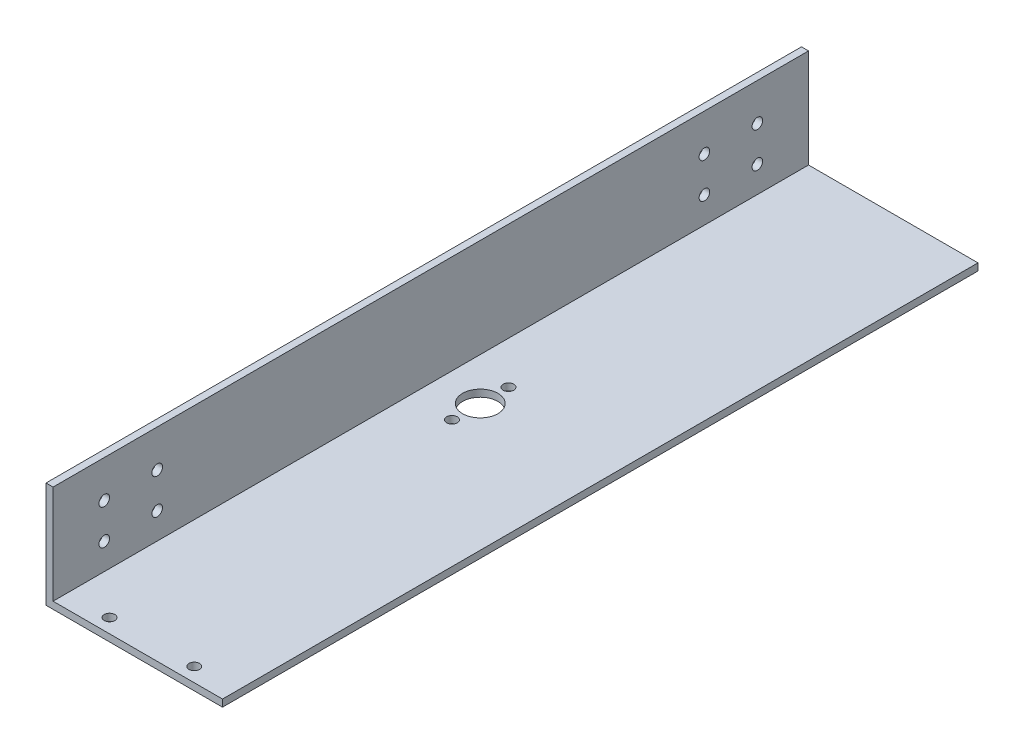
ISO-10303-21;
HEADER;
FILE_DESCRIPTION(('STEP AP214'),'2;1');
FILE_NAME('part.step','',(''),(''),'','','');
FILE_SCHEMA(('AUTOMOTIVE_DESIGN { 1 0 10303 214 1 1 1 1 }'));
ENDSEC;
DATA;
#1=APPLICATION_CONTEXT('core data for automotive mechanical design processes');
#2=APPLICATION_PROTOCOL_DEFINITION('international standard','automotive_design',2000,#1);
#3=PRODUCT_CONTEXT('',#1,'mechanical');
#4=PRODUCT('Part','Part','',(#3));
#5=PRODUCT_RELATED_PRODUCT_CATEGORY('part','',(#4));
#6=PRODUCT_DEFINITION_FORMATION('','',#4);
#7=PRODUCT_DEFINITION_CONTEXT('part definition',#1,'design');
#8=PRODUCT_DEFINITION('design','',#6,#7);
#9=PRODUCT_DEFINITION_SHAPE('','',#8);
#10=(LENGTH_UNIT() NAMED_UNIT(*) SI_UNIT(.MILLI.,.METRE.));
#11=(NAMED_UNIT(*) PLANE_ANGLE_UNIT() SI_UNIT($,.RADIAN.));
#12=(NAMED_UNIT(*) SI_UNIT($,.STERADIAN.) SOLID_ANGLE_UNIT());
#13=UNCERTAINTY_MEASURE_WITH_UNIT(LENGTH_MEASURE(1.E-05),#10,'distance_accuracy_value','');
#14=(GEOMETRIC_REPRESENTATION_CONTEXT(3) GLOBAL_UNCERTAINTY_ASSIGNED_CONTEXT((#13)) GLOBAL_UNIT_ASSIGNED_CONTEXT((#10,
#11,#12)) REPRESENTATION_CONTEXT('',''));
#15=CARTESIAN_POINT('',(0.,0.,0.));
#16=DIRECTION('',(0.,0.,1.));
#17=DIRECTION('',(1.,0.,0.));
#18=AXIS2_PLACEMENT_3D('',#15,#16,#17);
#19=CARTESIAN_POINT('',(0.,0.,0.));
#20=DIRECTION('',(0.,0.,-1.));
#21=DIRECTION('',(-1.,0.,0.));
#22=AXIS2_PLACEMENT_3D('',#19,#20,#21);
#23=PLANE('',#22);
#24=DIRECTION('',(1.,0.,0.));
#25=VECTOR('',#24,1.);
#26=CARTESIAN_POINT('',(50.,0.,0.));
#27=LINE('',#26,#25);
#28=CARTESIAN_POINT('',(0.,0.,0.));
#29=VERTEX_POINT('',#28);
#30=CARTESIAN_POINT('',(50.,0.,0.));
#31=VERTEX_POINT('',#30);
#32=EDGE_CURVE('E101',#29,#31,#27,.T.);
#33=ORIENTED_EDGE('',*,*,#32,.F.);
#34=DIRECTION('',(0.,-1.,0.));
#35=VECTOR('',#34,1.);
#36=CARTESIAN_POINT('',(0.,0.,0.));
#37=LINE('',#36,#35);
#38=CARTESIAN_POINT('',(0.,30.,0.));
#39=VERTEX_POINT('',#38);
#40=EDGE_CURVE('E123',#39,#29,#37,.T.);
#41=ORIENTED_EDGE('',*,*,#40,.F.);
#42=DIRECTION('',(-1.,0.,0.));
#43=VECTOR('',#42,1.);
#44=CARTESIAN_POINT('',(0.,30.,0.));
#45=LINE('',#44,#43);
#46=CARTESIAN_POINT('',(2.,30.,0.));
#47=VERTEX_POINT('',#46);
#48=EDGE_CURVE('E120',#47,#39,#45,.T.);
#49=ORIENTED_EDGE('',*,*,#48,.F.);
#50=DIRECTION('',(0.,1.,0.));
#51=VECTOR('',#50,1.);
#52=CARTESIAN_POINT('',(2.,30.,0.));
#53=LINE('',#52,#51);
#54=CARTESIAN_POINT('',(2.,2.,0.));
#55=VERTEX_POINT('',#54);
#56=EDGE_CURVE('E117',#55,#47,#53,.T.);
#57=ORIENTED_EDGE('',*,*,#56,.F.);
#58=DIRECTION('',(-1.,0.,0.));
#59=VECTOR('',#58,1.);
#60=CARTESIAN_POINT('',(2.,2.,0.));
#61=LINE('',#60,#59);
#62=CARTESIAN_POINT('',(50.,2.,0.));
#63=VERTEX_POINT('',#62);
#64=EDGE_CURVE('E104',#63,#55,#61,.T.);
#65=ORIENTED_EDGE('',*,*,#64,.F.);
#66=DIRECTION('',(0.,1.,0.));
#67=VECTOR('',#66,1.);
#68=CARTESIAN_POINT('',(50.,2.,0.));
#69=LINE('',#68,#67);
#70=EDGE_CURVE('E93',#31,#63,#69,.T.);
#71=ORIENTED_EDGE('',*,*,#70,.F.);
#72=EDGE_LOOP('',(#33,#41,#49,#57,#65,#71));
#73=FACE_BOUND('',#72,.T.);
#74=ADVANCED_FACE('F37',(#73),#23,.T.);
#75=CARTESIAN_POINT('',(0.,0.,272.309518948453));
#76=DIRECTION('',(1.,0.,0.));
#77=DIRECTION('',(0.,0.,-1.));
#78=AXIS2_PLACEMENT_3D('',#75,#76,#77);
#79=PLANE('',#78);
#80=CARTESIAN_POINT('',(0.,9.45,199.499999999999));
#81=DIRECTION('',(1.,0.,0.));
#82=DIRECTION('',(0.,0.,-1.));
#83=AXIS2_PLACEMENT_3D('',#80,#81,#82);
#84=CIRCLE('',#83,1.5);
#85=CARTESIAN_POINT('',(0.,9.45,197.999999999999));
#86=VERTEX_POINT('',#85);
#87=EDGE_CURVE('E198',#86,#86,#84,.T.);
#88=ORIENTED_EDGE('',*,*,#87,.T.);
#89=EDGE_LOOP('',(#88));
#90=FACE_BOUND('',#89,.T.);
#91=CARTESIAN_POINT('',(0.,19.45,199.499999999999));
#92=DIRECTION('',(1.,0.,0.));
#93=DIRECTION('',(0.,0.,-1.));
#94=AXIS2_PLACEMENT_3D('',#91,#92,#93);
#95=CIRCLE('',#94,1.5);
#96=CARTESIAN_POINT('',(0.,19.45,197.999999999999));
#97=VERTEX_POINT('',#96);
#98=EDGE_CURVE('E192',#97,#97,#95,.T.);
#99=ORIENTED_EDGE('',*,*,#98,.T.);
#100=EDGE_LOOP('',(#99));
#101=FACE_BOUND('',#100,.T.);
#102=CARTESIAN_POINT('',(0.,19.4500124763544,184.499999999997));
#103=DIRECTION('',(1.,0.,0.));
#104=DIRECTION('',(0.,0.,-1.));
#105=AXIS2_PLACEMENT_3D('',#102,#103,#104);
#106=CIRCLE('',#105,1.5);
#107=CARTESIAN_POINT('',(0.,19.4500124763544,182.999999999997));
#108=VERTEX_POINT('',#107);
#109=EDGE_CURVE('E186',#108,#108,#106,.T.);
#110=ORIENTED_EDGE('',*,*,#109,.T.);
#111=EDGE_LOOP('',(#110));
#112=FACE_BOUND('',#111,.T.);
#113=CARTESIAN_POINT('',(0.,9.45,184.499999999999));
#114=DIRECTION('',(1.,0.,0.));
#115=DIRECTION('',(0.,0.,-1.));
#116=AXIS2_PLACEMENT_3D('',#113,#114,#115);
#117=CIRCLE('',#116,1.5);
#118=CARTESIAN_POINT('',(0.,9.45,182.999999999999));
#119=VERTEX_POINT('',#118);
#120=EDGE_CURVE('E180',#119,#119,#117,.T.);
#121=ORIENTED_EDGE('',*,*,#120,.T.);
#122=EDGE_LOOP('',(#121));
#123=FACE_BOUND('',#122,.T.);
#124=CARTESIAN_POINT('',(0.,19.45,29.5));
#125=DIRECTION('',(1.,0.,0.));
#126=DIRECTION('',(0.,0.,-1.));
#127=AXIS2_PLACEMENT_3D('',#124,#125,#126);
#128=CIRCLE('',#127,1.5);
#129=CARTESIAN_POINT('',(0.,19.45,28.));
#130=VERTEX_POINT('',#129);
#131=EDGE_CURVE('E174',#130,#130,#128,.T.);
#132=ORIENTED_EDGE('',*,*,#131,.T.);
#133=EDGE_LOOP('',(#132));
#134=FACE_BOUND('',#133,.T.);
#135=CARTESIAN_POINT('',(0.,9.45000000000001,29.5));
#136=DIRECTION('',(1.,0.,0.));
#137=DIRECTION('',(0.,0.,-1.));
#138=AXIS2_PLACEMENT_3D('',#135,#136,#137);
#139=CIRCLE('',#138,1.5);
#140=CARTESIAN_POINT('',(0.,9.45000000000001,28.));
#141=VERTEX_POINT('',#140);
#142=EDGE_CURVE('E168',#141,#141,#139,.T.);
#143=ORIENTED_EDGE('',*,*,#142,.T.);
#144=EDGE_LOOP('',(#143));
#145=FACE_BOUND('',#144,.T.);
#146=CARTESIAN_POINT('',(0.,9.45000000000001,14.5));
#147=DIRECTION('',(1.,0.,0.));
#148=DIRECTION('',(0.,0.,-1.));
#149=AXIS2_PLACEMENT_3D('',#146,#147,#148);
#150=CIRCLE('',#149,1.5);
#151=CARTESIAN_POINT('',(0.,9.45000000000001,13.));
#152=VERTEX_POINT('',#151);
#153=EDGE_CURVE('E162',#152,#152,#150,.T.);
#154=ORIENTED_EDGE('',*,*,#153,.T.);
#155=EDGE_LOOP('',(#154));
#156=FACE_BOUND('',#155,.T.);
#157=CARTESIAN_POINT('',(0.,19.45,14.5));
#158=DIRECTION('',(1.,0.,0.));
#159=DIRECTION('',(0.,0.,-1.));
#160=AXIS2_PLACEMENT_3D('',#157,#158,#159);
#161=CIRCLE('',#160,1.5);
#162=CARTESIAN_POINT('',(0.,19.45,13.));
#163=VERTEX_POINT('',#162);
#164=EDGE_CURVE('E156',#163,#163,#161,.T.);
#165=ORIENTED_EDGE('',*,*,#164,.T.);
#166=EDGE_LOOP('',(#165));
#167=FACE_BOUND('',#166,.T.);
#168=DIRECTION('',(0.,0.,-1.));
#169=VECTOR('',#168,1.);
#170=CARTESIAN_POINT('',(0.,0.,272.309518948453));
#171=LINE('',#170,#169);
#172=CARTESIAN_POINT('',(0.,0.,214.));
#173=VERTEX_POINT('',#172);
#174=EDGE_CURVE('E107',#173,#29,#171,.T.);
#175=ORIENTED_EDGE('',*,*,#174,.F.);
#176=DIRECTION('',(0.,1.,0.));
#177=VECTOR('',#176,1.);
#178=CARTESIAN_POINT('',(0.,0.,214.));
#179=LINE('',#178,#177);
#180=CARTESIAN_POINT('',(0.,30.,214.));
#181=VERTEX_POINT('',#180);
#182=EDGE_CURVE('E41',#173,#181,#179,.T.);
#183=ORIENTED_EDGE('',*,*,#182,.T.);
#184=DIRECTION('',(0.,0.,-1.));
#185=VECTOR('',#184,1.);
#186=CARTESIAN_POINT('',(0.,30.,272.309518948453));
#187=LINE('',#186,#185);
#188=EDGE_CURVE('E126',#181,#39,#187,.T.);
#189=ORIENTED_EDGE('',*,*,#188,.T.);
#190=ORIENTED_EDGE('',*,*,#40,.T.);
#191=EDGE_LOOP('',(#175,#183,#189,#190));
#192=FACE_BOUND('',#191,.T.);
#193=ADVANCED_FACE('F246',(#90,#101,#112,#123,#134,#145,#156,#167,#192),#79,.F.);
#194=CARTESIAN_POINT('',(0.,30.,272.309518948453));
#195=DIRECTION('',(0.,-1.,0.));
#196=DIRECTION('',(0.,0.,-1.));
#197=AXIS2_PLACEMENT_3D('',#194,#195,#196);
#198=PLANE('',#197);
#199=ORIENTED_EDGE('',*,*,#188,.F.);
#200=DIRECTION('',(1.,0.,0.));
#201=VECTOR('',#200,1.);
#202=CARTESIAN_POINT('',(0.,30.,214.));
#203=LINE('',#202,#201);
#204=CARTESIAN_POINT('',(2.,30.,214.));
#205=VERTEX_POINT('',#204);
#206=EDGE_CURVE('E137',#181,#205,#203,.T.);
#207=ORIENTED_EDGE('',*,*,#206,.T.);
#208=DIRECTION('',(0.,0.,-1.));
#209=VECTOR('',#208,1.);
#210=CARTESIAN_POINT('',(2.,30.,272.309518948453));
#211=LINE('',#210,#209);
#212=EDGE_CURVE('E128',#205,#47,#211,.T.);
#213=ORIENTED_EDGE('',*,*,#212,.T.);
#214=ORIENTED_EDGE('',*,*,#48,.T.);
#215=EDGE_LOOP('',(#199,#207,#213,#214));
#216=FACE_BOUND('',#215,.T.);
#217=ADVANCED_FACE('F251',(#216),#198,.F.);
#218=CARTESIAN_POINT('',(2.,30.,272.309518948453));
#219=DIRECTION('',(-1.,0.,0.));
#220=DIRECTION('',(0.,0.,1.));
#221=AXIS2_PLACEMENT_3D('',#218,#219,#220);
#222=PLANE('',#221);
#223=CARTESIAN_POINT('',(2.,9.45,199.499999999999));
#224=DIRECTION('',(1.,0.,0.));
#225=DIRECTION('',(0.,0.,-1.));
#226=AXIS2_PLACEMENT_3D('',#223,#224,#225);
#227=CIRCLE('',#226,1.5);
#228=CARTESIAN_POINT('',(2.,9.45,197.999999999999));
#229=VERTEX_POINT('',#228);
#230=EDGE_CURVE('E201',#229,#229,#227,.T.);
#231=ORIENTED_EDGE('',*,*,#230,.F.);
#232=EDGE_LOOP('',(#231));
#233=FACE_BOUND('',#232,.T.);
#234=CARTESIAN_POINT('',(2.,19.45,199.499999999999));
#235=DIRECTION('',(1.,0.,0.));
#236=DIRECTION('',(0.,0.,-1.));
#237=AXIS2_PLACEMENT_3D('',#234,#235,#236);
#238=CIRCLE('',#237,1.5);
#239=CARTESIAN_POINT('',(2.,19.45,197.999999999999));
#240=VERTEX_POINT('',#239);
#241=EDGE_CURVE('E195',#240,#240,#238,.T.);
#242=ORIENTED_EDGE('',*,*,#241,.F.);
#243=EDGE_LOOP('',(#242));
#244=FACE_BOUND('',#243,.T.);
#245=CARTESIAN_POINT('',(2.,19.4500124763544,184.499999999997));
#246=DIRECTION('',(1.,0.,0.));
#247=DIRECTION('',(0.,0.,-1.));
#248=AXIS2_PLACEMENT_3D('',#245,#246,#247);
#249=CIRCLE('',#248,1.5);
#250=CARTESIAN_POINT('',(2.,19.4500124763544,182.999999999997));
#251=VERTEX_POINT('',#250);
#252=EDGE_CURVE('E189',#251,#251,#249,.T.);
#253=ORIENTED_EDGE('',*,*,#252,.F.);
#254=EDGE_LOOP('',(#253));
#255=FACE_BOUND('',#254,.T.);
#256=CARTESIAN_POINT('',(2.,9.45,184.499999999999));
#257=DIRECTION('',(1.,0.,0.));
#258=DIRECTION('',(0.,0.,-1.));
#259=AXIS2_PLACEMENT_3D('',#256,#257,#258);
#260=CIRCLE('',#259,1.5);
#261=CARTESIAN_POINT('',(2.,9.45,182.999999999999));
#262=VERTEX_POINT('',#261);
#263=EDGE_CURVE('E183',#262,#262,#260,.T.);
#264=ORIENTED_EDGE('',*,*,#263,.F.);
#265=EDGE_LOOP('',(#264));
#266=FACE_BOUND('',#265,.T.);
#267=CARTESIAN_POINT('',(2.,19.45,29.5));
#268=DIRECTION('',(1.,0.,0.));
#269=DIRECTION('',(0.,0.,-1.));
#270=AXIS2_PLACEMENT_3D('',#267,#268,#269);
#271=CIRCLE('',#270,1.5);
#272=CARTESIAN_POINT('',(2.,19.45,28.));
#273=VERTEX_POINT('',#272);
#274=EDGE_CURVE('E177',#273,#273,#271,.T.);
#275=ORIENTED_EDGE('',*,*,#274,.F.);
#276=EDGE_LOOP('',(#275));
#277=FACE_BOUND('',#276,.T.);
#278=CARTESIAN_POINT('',(2.,9.45000000000001,29.5));
#279=DIRECTION('',(1.,0.,0.));
#280=DIRECTION('',(0.,0.,-1.));
#281=AXIS2_PLACEMENT_3D('',#278,#279,#280);
#282=CIRCLE('',#281,1.5);
#283=CARTESIAN_POINT('',(2.,9.45000000000001,28.));
#284=VERTEX_POINT('',#283);
#285=EDGE_CURVE('E171',#284,#284,#282,.T.);
#286=ORIENTED_EDGE('',*,*,#285,.F.);
#287=EDGE_LOOP('',(#286));
#288=FACE_BOUND('',#287,.T.);
#289=CARTESIAN_POINT('',(2.,9.45000000000001,14.5));
#290=DIRECTION('',(1.,0.,0.));
#291=DIRECTION('',(0.,0.,-1.));
#292=AXIS2_PLACEMENT_3D('',#289,#290,#291);
#293=CIRCLE('',#292,1.5);
#294=CARTESIAN_POINT('',(2.,9.45000000000001,13.));
#295=VERTEX_POINT('',#294);
#296=EDGE_CURVE('E165',#295,#295,#293,.T.);
#297=ORIENTED_EDGE('',*,*,#296,.F.);
#298=EDGE_LOOP('',(#297));
#299=FACE_BOUND('',#298,.T.);
#300=CARTESIAN_POINT('',(2.,19.45,14.5));
#301=DIRECTION('',(1.,0.,0.));
#302=DIRECTION('',(0.,0.,-1.));
#303=AXIS2_PLACEMENT_3D('',#300,#301,#302);
#304=CIRCLE('',#303,1.5);
#305=CARTESIAN_POINT('',(2.,19.45,13.));
#306=VERTEX_POINT('',#305);
#307=EDGE_CURVE('E159',#306,#306,#304,.T.);
#308=ORIENTED_EDGE('',*,*,#307,.F.);
#309=EDGE_LOOP('',(#308));
#310=FACE_BOUND('',#309,.T.);
#311=ORIENTED_EDGE('',*,*,#212,.F.);
#312=DIRECTION('',(0.,-1.,0.));
#313=VECTOR('',#312,1.);
#314=CARTESIAN_POINT('',(2.,30.,214.));
#315=LINE('',#314,#313);
#316=CARTESIAN_POINT('',(2.,2.,214.));
#317=VERTEX_POINT('',#316);
#318=EDGE_CURVE('E135',#205,#317,#315,.T.);
#319=ORIENTED_EDGE('',*,*,#318,.T.);
#320=DIRECTION('',(0.,0.,-1.));
#321=VECTOR('',#320,1.);
#322=CARTESIAN_POINT('',(2.,2.,272.309518948453));
#323=LINE('',#322,#321);
#324=EDGE_CURVE('E130',#317,#55,#323,.T.);
#325=ORIENTED_EDGE('',*,*,#324,.T.);
#326=ORIENTED_EDGE('',*,*,#56,.T.);
#327=EDGE_LOOP('',(#311,#319,#325,#326));
#328=FACE_BOUND('',#327,.T.);
#329=ADVANCED_FACE('F221',(#233,#244,#255,#266,#277,#288,#299,#310,#328),#222,.F.);
#330=CARTESIAN_POINT('',(2.,2.,272.309518948453));
#331=DIRECTION('',(0.,-1.,0.));
#332=DIRECTION('',(0.,0.,-1.));
#333=AXIS2_PLACEMENT_3D('',#330,#331,#332);
#334=PLANE('',#333);
#335=CARTESIAN_POINT('',(38.0000000000025,2.00000000000002,210.000000000004));
#336=DIRECTION('',(0.,1.,0.));
#337=DIRECTION('',(0.,0.,1.));
#338=AXIS2_PLACEMENT_3D('',#335,#336,#337);
#339=CIRCLE('',#338,1.50000000000002);
#340=CARTESIAN_POINT('',(38.0000000000025,2.00000000000002,211.500000000004));
#341=VERTEX_POINT('',#340);
#342=EDGE_CURVE('E213',#341,#341,#339,.T.);
#343=ORIENTED_EDGE('',*,*,#342,.F.);
#344=EDGE_LOOP('',(#343));
#345=FACE_BOUND('',#344,.T.);
#346=CARTESIAN_POINT('',(14.0000000000025,2.00000000000002,210.000000000004));
#347=DIRECTION('',(0.,1.,0.));
#348=DIRECTION('',(0.,0.,1.));
#349=AXIS2_PLACEMENT_3D('',#346,#347,#348);
#350=CIRCLE('',#349,1.50000000000001);
#351=CARTESIAN_POINT('',(14.0000000000025,2.00000000000002,211.500000000004));
#352=VERTEX_POINT('',#351);
#353=EDGE_CURVE('E207',#352,#352,#350,.T.);
#354=ORIENTED_EDGE('',*,*,#353,.F.);
#355=EDGE_LOOP('',(#354));
#356=FACE_BOUND('',#355,.T.);
#357=CARTESIAN_POINT('',(14.0000001259329,2.,96.9999999761338));
#358=DIRECTION('',(0.,-1.,0.));
#359=DIRECTION('',(0.,0.,-1.));
#360=AXIS2_PLACEMENT_3D('',#357,#358,#359);
#361=CIRCLE('',#360,1.50000000146554);
#362=CARTESIAN_POINT('',(14.0000001259329,2.,95.4999999746682));
#363=VERTEX_POINT('',#362);
#364=EDGE_CURVE('E150',#363,#363,#361,.T.);
#365=ORIENTED_EDGE('',*,*,#364,.T.);
#366=EDGE_LOOP('',(#365));
#367=FACE_BOUND('',#366,.T.);
#368=CARTESIAN_POINT('',(14.000000125933,2.,112.999999976134));
#369=DIRECTION('',(0.,-1.,0.));
#370=DIRECTION('',(0.,0.,-1.));
#371=AXIS2_PLACEMENT_3D('',#368,#369,#370);
#372=CIRCLE('',#371,1.50000000146554);
#373=CARTESIAN_POINT('',(14.000000125933,2.,111.499999974668));
#374=VERTEX_POINT('',#373);
#375=EDGE_CURVE('E144',#374,#374,#372,.T.);
#376=ORIENTED_EDGE('',*,*,#375,.T.);
#377=EDGE_LOOP('',(#376));
#378=FACE_BOUND('',#377,.T.);
#379=CARTESIAN_POINT('',(13.9999999997861,2.,105.));
#380=DIRECTION('',(0.,-1.,0.));
#381=DIRECTION('',(0.,0.,-1.));
#382=AXIS2_PLACEMENT_3D('',#379,#380,#381);
#383=CIRCLE('',#382,5.);
#384=CARTESIAN_POINT('',(13.9999999997861,2.,100.));
#385=VERTEX_POINT('',#384);
#386=EDGE_CURVE('E109',#385,#385,#383,.T.);
#387=ORIENTED_EDGE('',*,*,#386,.T.);
#388=EDGE_LOOP('',(#387));
#389=FACE_BOUND('',#388,.T.);
#390=ORIENTED_EDGE('',*,*,#324,.F.);
#391=DIRECTION('',(1.,0.,0.));
#392=VECTOR('',#391,1.);
#393=CARTESIAN_POINT('',(2.,2.,214.));
#394=LINE('',#393,#392);
#395=CARTESIAN_POINT('',(50.,2.,214.));
#396=VERTEX_POINT('',#395);
#397=EDGE_CURVE('E58',#317,#396,#394,.T.);
#398=ORIENTED_EDGE('',*,*,#397,.T.);
#399=DIRECTION('',(0.,0.,-1.));
#400=VECTOR('',#399,1.);
#401=CARTESIAN_POINT('',(50.,2.,272.309518948453));
#402=LINE('',#401,#400);
#403=EDGE_CURVE('E97',#396,#63,#402,.T.);
#404=ORIENTED_EDGE('',*,*,#403,.T.);
#405=ORIENTED_EDGE('',*,*,#64,.T.);
#406=EDGE_LOOP('',(#390,#398,#404,#405));
#407=FACE_BOUND('',#406,.T.);
#408=ADVANCED_FACE('F133',(#345,#356,#367,#378,#389,#407),#334,.F.);
#409=CARTESIAN_POINT('',(50.,2.,272.309518948453));
#410=DIRECTION('',(-1.,0.,0.));
#411=DIRECTION('',(0.,0.,1.));
#412=AXIS2_PLACEMENT_3D('',#409,#410,#411);
#413=PLANE('',#412);
#414=ORIENTED_EDGE('',*,*,#403,.F.);
#415=DIRECTION('',(0.,-1.,0.));
#416=VECTOR('',#415,1.);
#417=CARTESIAN_POINT('',(50.,2.,214.));
#418=LINE('',#417,#416);
#419=CARTESIAN_POINT('',(50.,0.,214.));
#420=VERTEX_POINT('',#419);
#421=EDGE_CURVE('E46',#396,#420,#418,.T.);
#422=ORIENTED_EDGE('',*,*,#421,.T.);
#423=DIRECTION('',(0.,0.,-1.));
#424=VECTOR('',#423,1.);
#425=CARTESIAN_POINT('',(50.,0.,272.309518948453));
#426=LINE('',#425,#424);
#427=EDGE_CURVE('E90',#420,#31,#426,.T.);
#428=ORIENTED_EDGE('',*,*,#427,.T.);
#429=ORIENTED_EDGE('',*,*,#70,.T.);
#430=EDGE_LOOP('',(#414,#422,#428,#429));
#431=FACE_BOUND('',#430,.T.);
#432=ADVANCED_FACE('F92',(#431),#413,.F.);
#433=CARTESIAN_POINT('',(50.,0.,272.309518948453));
#434=DIRECTION('',(0.,1.,0.));
#435=DIRECTION('',(-1.,0.,0.));
#436=AXIS2_PLACEMENT_3D('',#433,#434,#435);
#437=PLANE('',#436);
#438=CARTESIAN_POINT('',(38.0000000000025,0.,210.000000000004));
#439=DIRECTION('',(0.,1.,0.));
#440=DIRECTION('',(0.,0.,1.));
#441=AXIS2_PLACEMENT_3D('',#438,#439,#440);
#442=CIRCLE('',#441,1.50000000000002);
#443=CARTESIAN_POINT('',(38.0000000000025,0.,211.500000000004));
#444=VERTEX_POINT('',#443);
#445=EDGE_CURVE('E210',#444,#444,#442,.T.);
#446=ORIENTED_EDGE('',*,*,#445,.T.);
#447=EDGE_LOOP('',(#446));
#448=FACE_BOUND('',#447,.T.);
#449=CARTESIAN_POINT('',(14.0000000000025,0.,210.000000000004));
#450=DIRECTION('',(0.,1.,0.));
#451=DIRECTION('',(0.,0.,1.));
#452=AXIS2_PLACEMENT_3D('',#449,#450,#451);
#453=CIRCLE('',#452,1.50000000000001);
#454=CARTESIAN_POINT('',(14.0000000000025,0.,211.500000000004));
#455=VERTEX_POINT('',#454);
#456=EDGE_CURVE('E204',#455,#455,#453,.T.);
#457=ORIENTED_EDGE('',*,*,#456,.T.);
#458=EDGE_LOOP('',(#457));
#459=FACE_BOUND('',#458,.T.);
#460=CARTESIAN_POINT('',(14.0000001259329,0.,96.9999999761338));
#461=DIRECTION('',(0.,-1.,0.));
#462=DIRECTION('',(1.,0.,0.));
#463=AXIS2_PLACEMENT_3D('',#460,#461,#462);
#464=CIRCLE('',#463,1.50000000146554);
#465=CARTESIAN_POINT('',(15.5000001273984,0.,96.9999999761338));
#466=VERTEX_POINT('',#465);
#467=EDGE_CURVE('E153',#466,#466,#464,.T.);
#468=ORIENTED_EDGE('',*,*,#467,.F.);
#469=EDGE_LOOP('',(#468));
#470=FACE_BOUND('',#469,.T.);
#471=CARTESIAN_POINT('',(14.000000125933,0.,112.999999976134));
#472=DIRECTION('',(0.,-1.,0.));
#473=DIRECTION('',(1.,0.,0.));
#474=AXIS2_PLACEMENT_3D('',#471,#472,#473);
#475=CIRCLE('',#474,1.50000000146554);
#476=CARTESIAN_POINT('',(15.5000001273985,0.,112.999999976134));
#477=VERTEX_POINT('',#476);
#478=EDGE_CURVE('E147',#477,#477,#475,.T.);
#479=ORIENTED_EDGE('',*,*,#478,.F.);
#480=EDGE_LOOP('',(#479));
#481=FACE_BOUND('',#480,.T.);
#482=CARTESIAN_POINT('',(13.9999999997861,0.,105.));
#483=DIRECTION('',(0.,-1.,0.));
#484=DIRECTION('',(1.,0.,0.));
#485=AXIS2_PLACEMENT_3D('',#482,#483,#484);
#486=CIRCLE('',#485,5.);
#487=CARTESIAN_POINT('',(18.9999999997861,0.,105.));
#488=VERTEX_POINT('',#487);
#489=EDGE_CURVE('E112',#488,#488,#486,.T.);
#490=ORIENTED_EDGE('',*,*,#489,.F.);
#491=EDGE_LOOP('',(#490));
#492=FACE_BOUND('',#491,.T.);
#493=ORIENTED_EDGE('',*,*,#427,.F.);
#494=DIRECTION('',(-1.,0.,0.));
#495=VECTOR('',#494,1.);
#496=CARTESIAN_POINT('',(50.,0.,214.));
#497=LINE('',#496,#495);
#498=EDGE_CURVE('E11',#420,#173,#497,.T.);
#499=ORIENTED_EDGE('',*,*,#498,.T.);
#500=ORIENTED_EDGE('',*,*,#174,.T.);
#501=ORIENTED_EDGE('',*,*,#32,.T.);
#502=EDGE_LOOP('',(#493,#499,#500,#501));
#503=FACE_BOUND('',#502,.T.);
#504=ADVANCED_FACE('F39',(#448,#459,#470,#481,#492,#503),#437,.F.);
#505=CARTESIAN_POINT('',(88.0000001261503,-12.9999996544644,214.));
#506=DIRECTION('',(0.,0.,-1.));
#507=DIRECTION('',(-1.,0.,0.));
#508=AXIS2_PLACEMENT_3D('',#505,#506,#507);
#509=PLANE('',#508);
#510=ORIENTED_EDGE('',*,*,#421,.F.);
#511=ORIENTED_EDGE('',*,*,#397,.F.);
#512=ORIENTED_EDGE('',*,*,#318,.F.);
#513=ORIENTED_EDGE('',*,*,#206,.F.);
#514=ORIENTED_EDGE('',*,*,#182,.F.);
#515=ORIENTED_EDGE('',*,*,#498,.F.);
#516=EDGE_LOOP('',(#510,#511,#512,#513,#514,#515));
#517=FACE_BOUND('',#516,.T.);
#518=ADVANCED_FACE('F234',(#517),#509,.F.);
#519=CARTESIAN_POINT('',(13.9999999997861,30.,105.));
#520=DIRECTION('',(0.,-1.,0.));
#521=DIRECTION('',(1.,0.,0.));
#522=AXIS2_PLACEMENT_3D('',#519,#520,#521);
#523=CYLINDRICAL_SURFACE('',#522,5.);
#524=ORIENTED_EDGE('',*,*,#489,.T.);
#525=EDGE_LOOP('',(#524));
#526=FACE_BOUND('',#525,.T.);
#527=ORIENTED_EDGE('',*,*,#386,.F.);
#528=EDGE_LOOP('',(#527));
#529=FACE_BOUND('',#528,.T.);
#530=ADVANCED_FACE('F231',(#526,#529),#523,.F.);
#531=CARTESIAN_POINT('',(14.000000125933,30.,112.999999976134));
#532=DIRECTION('',(0.,-1.,0.));
#533=DIRECTION('',(1.,0.,0.));
#534=AXIS2_PLACEMENT_3D('',#531,#532,#533);
#535=CYLINDRICAL_SURFACE('',#534,1.50000000146554);
#536=ORIENTED_EDGE('',*,*,#478,.T.);
#537=EDGE_LOOP('',(#536));
#538=FACE_BOUND('',#537,.T.);
#539=ORIENTED_EDGE('',*,*,#375,.F.);
#540=EDGE_LOOP('',(#539));
#541=FACE_BOUND('',#540,.T.);
#542=ADVANCED_FACE('F233',(#538,#541),#535,.F.);
#543=CARTESIAN_POINT('',(14.0000001259329,30.,96.9999999761338));
#544=DIRECTION('',(0.,-1.,0.));
#545=DIRECTION('',(1.,0.,0.));
#546=AXIS2_PLACEMENT_3D('',#543,#544,#545);
#547=CYLINDRICAL_SURFACE('',#546,1.50000000146554);
#548=ORIENTED_EDGE('',*,*,#467,.T.);
#549=EDGE_LOOP('',(#548));
#550=FACE_BOUND('',#549,.T.);
#551=ORIENTED_EDGE('',*,*,#364,.F.);
#552=EDGE_LOOP('',(#551));
#553=FACE_BOUND('',#552,.T.);
#554=ADVANCED_FACE('F241',(#550,#553),#547,.F.);
#555=CARTESIAN_POINT('',(2.,19.45,14.5));
#556=DIRECTION('',(1.,0.,0.));
#557=DIRECTION('',(0.,0.,-1.));
#558=AXIS2_PLACEMENT_3D('',#555,#556,#557);
#559=CYLINDRICAL_SURFACE('',#558,1.5);
#560=ORIENTED_EDGE('',*,*,#164,.F.);
#561=EDGE_LOOP('',(#560));
#562=FACE_BOUND('',#561,.T.);
#563=ORIENTED_EDGE('',*,*,#307,.T.);
#564=EDGE_LOOP('',(#563));
#565=FACE_BOUND('',#564,.T.);
#566=ADVANCED_FACE('F282',(#562,#565),#559,.F.);
#567=CARTESIAN_POINT('',(2.,9.45000000000001,14.5));
#568=DIRECTION('',(1.,0.,0.));
#569=DIRECTION('',(0.,0.,-1.));
#570=AXIS2_PLACEMENT_3D('',#567,#568,#569);
#571=CYLINDRICAL_SURFACE('',#570,1.5);
#572=ORIENTED_EDGE('',*,*,#153,.F.);
#573=EDGE_LOOP('',(#572));
#574=FACE_BOUND('',#573,.T.);
#575=ORIENTED_EDGE('',*,*,#296,.T.);
#576=EDGE_LOOP('',(#575));
#577=FACE_BOUND('',#576,.T.);
#578=ADVANCED_FACE('F287',(#574,#577),#571,.F.);
#579=CARTESIAN_POINT('',(2.,9.45000000000001,29.5));
#580=DIRECTION('',(1.,0.,0.));
#581=DIRECTION('',(0.,0.,-1.));
#582=AXIS2_PLACEMENT_3D('',#579,#580,#581);
#583=CYLINDRICAL_SURFACE('',#582,1.5);
#584=ORIENTED_EDGE('',*,*,#142,.F.);
#585=EDGE_LOOP('',(#584));
#586=FACE_BOUND('',#585,.T.);
#587=ORIENTED_EDGE('',*,*,#285,.T.);
#588=EDGE_LOOP('',(#587));
#589=FACE_BOUND('',#588,.T.);
#590=ADVANCED_FACE('F293',(#586,#589),#583,.F.);
#591=CARTESIAN_POINT('',(2.,19.45,29.5));
#592=DIRECTION('',(1.,0.,0.));
#593=DIRECTION('',(0.,0.,-1.));
#594=AXIS2_PLACEMENT_3D('',#591,#592,#593);
#595=CYLINDRICAL_SURFACE('',#594,1.5);
#596=ORIENTED_EDGE('',*,*,#131,.F.);
#597=EDGE_LOOP('',(#596));
#598=FACE_BOUND('',#597,.T.);
#599=ORIENTED_EDGE('',*,*,#274,.T.);
#600=EDGE_LOOP('',(#599));
#601=FACE_BOUND('',#600,.T.);
#602=ADVANCED_FACE('F297',(#598,#601),#595,.F.);
#603=CARTESIAN_POINT('',(2.,9.45,184.499999999999));
#604=DIRECTION('',(1.,0.,0.));
#605=DIRECTION('',(0.,0.,-1.));
#606=AXIS2_PLACEMENT_3D('',#603,#604,#605);
#607=CYLINDRICAL_SURFACE('',#606,1.5);
#608=ORIENTED_EDGE('',*,*,#120,.F.);
#609=EDGE_LOOP('',(#608));
#610=FACE_BOUND('',#609,.T.);
#611=ORIENTED_EDGE('',*,*,#263,.T.);
#612=EDGE_LOOP('',(#611));
#613=FACE_BOUND('',#612,.T.);
#614=ADVANCED_FACE('F301',(#610,#613),#607,.F.);
#615=CARTESIAN_POINT('',(2.,19.4500124763544,184.499999999997));
#616=DIRECTION('',(1.,0.,0.));
#617=DIRECTION('',(0.,0.,-1.));
#618=AXIS2_PLACEMENT_3D('',#615,#616,#617);
#619=CYLINDRICAL_SURFACE('',#618,1.5);
#620=ORIENTED_EDGE('',*,*,#109,.F.);
#621=EDGE_LOOP('',(#620));
#622=FACE_BOUND('',#621,.T.);
#623=ORIENTED_EDGE('',*,*,#252,.T.);
#624=EDGE_LOOP('',(#623));
#625=FACE_BOUND('',#624,.T.);
#626=ADVANCED_FACE('F305',(#622,#625),#619,.F.);
#627=CARTESIAN_POINT('',(2.,19.45,199.499999999999));
#628=DIRECTION('',(1.,0.,0.));
#629=DIRECTION('',(0.,0.,-1.));
#630=AXIS2_PLACEMENT_3D('',#627,#628,#629);
#631=CYLINDRICAL_SURFACE('',#630,1.5);
#632=ORIENTED_EDGE('',*,*,#98,.F.);
#633=EDGE_LOOP('',(#632));
#634=FACE_BOUND('',#633,.T.);
#635=ORIENTED_EDGE('',*,*,#241,.T.);
#636=EDGE_LOOP('',(#635));
#637=FACE_BOUND('',#636,.T.);
#638=ADVANCED_FACE('F309',(#634,#637),#631,.F.);
#639=CARTESIAN_POINT('',(2.,9.45,199.499999999999));
#640=DIRECTION('',(1.,0.,0.));
#641=DIRECTION('',(0.,0.,-1.));
#642=AXIS2_PLACEMENT_3D('',#639,#640,#641);
#643=CYLINDRICAL_SURFACE('',#642,1.5);
#644=ORIENTED_EDGE('',*,*,#87,.F.);
#645=EDGE_LOOP('',(#644));
#646=FACE_BOUND('',#645,.T.);
#647=ORIENTED_EDGE('',*,*,#230,.T.);
#648=EDGE_LOOP('',(#647));
#649=FACE_BOUND('',#648,.T.);
#650=ADVANCED_FACE('F313',(#646,#649),#643,.F.);
#651=CARTESIAN_POINT('',(14.0000000000025,2.00000000000002,210.000000000004));
#652=DIRECTION('',(0.,1.,0.));
#653=DIRECTION('',(0.,0.,1.));
#654=AXIS2_PLACEMENT_3D('',#651,#652,#653);
#655=CYLINDRICAL_SURFACE('',#654,1.50000000000001);
#656=ORIENTED_EDGE('',*,*,#456,.F.);
#657=EDGE_LOOP('',(#656));
#658=FACE_BOUND('',#657,.T.);
#659=ORIENTED_EDGE('',*,*,#353,.T.);
#660=EDGE_LOOP('',(#659));
#661=FACE_BOUND('',#660,.T.);
#662=ADVANCED_FACE('F317',(#658,#661),#655,.F.);
#663=CARTESIAN_POINT('',(38.0000000000025,2.00000000000002,210.000000000004));
#664=DIRECTION('',(0.,1.,0.));
#665=DIRECTION('',(0.,0.,1.));
#666=AXIS2_PLACEMENT_3D('',#663,#664,#665);
#667=CYLINDRICAL_SURFACE('',#666,1.50000000000002);
#668=ORIENTED_EDGE('',*,*,#445,.F.);
#669=EDGE_LOOP('',(#668));
#670=FACE_BOUND('',#669,.T.);
#671=ORIENTED_EDGE('',*,*,#342,.T.);
#672=EDGE_LOOP('',(#671));
#673=FACE_BOUND('',#672,.T.);
#674=ADVANCED_FACE('F217',(#670,#673),#667,.F.);
#675=CLOSED_SHELL('',(#74,#193,#217,#329,#408,#432,#504,#518,#530,#542,#554,#566,#578,#590,#602,
#614,#626,#638,#650,#662,#674));
#676=MANIFOLD_SOLID_BREP('B2',#675);
#677=ADVANCED_BREP_SHAPE_REPRESENTATION('',(#18,#676),#14);
#678=SHAPE_DEFINITION_REPRESENTATION(#9,#677);
ENDSEC;
END-ISO-10303-21;
